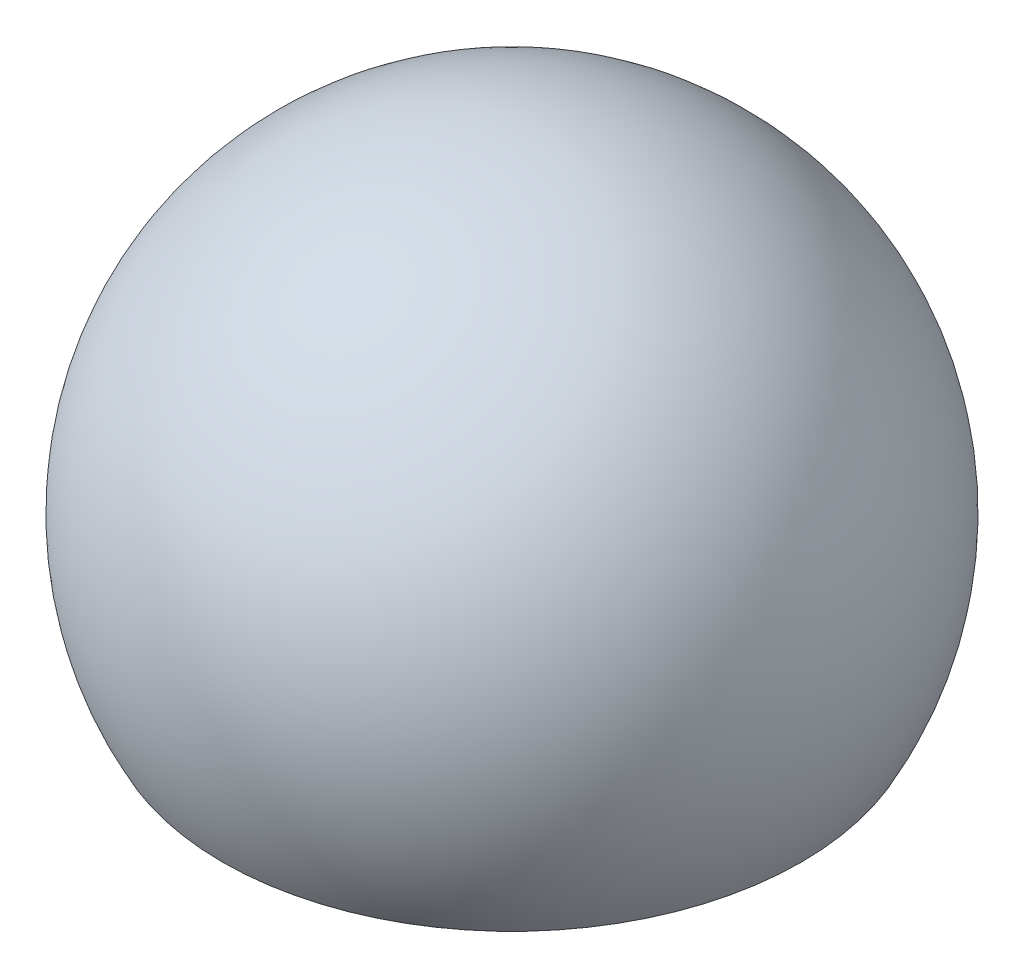
ISO-10303-21;
HEADER;
FILE_DESCRIPTION(('STEP AP214'),'2;1');
FILE_NAME('part.step','',(''),(''),'','','');
FILE_SCHEMA(('AUTOMOTIVE_DESIGN { 1 0 10303 214 1 1 1 1 }'));
ENDSEC;
DATA;
#1=APPLICATION_CONTEXT('core data for automotive mechanical design processes');
#2=APPLICATION_PROTOCOL_DEFINITION('international standard','automotive_design',2000,#1);
#3=PRODUCT_CONTEXT('',#1,'mechanical');
#4=PRODUCT('Part','Part','',(#3));
#5=PRODUCT_RELATED_PRODUCT_CATEGORY('part','',(#4));
#6=PRODUCT_DEFINITION_FORMATION('','',#4);
#7=PRODUCT_DEFINITION_CONTEXT('part definition',#1,'design');
#8=PRODUCT_DEFINITION('design','',#6,#7);
#9=PRODUCT_DEFINITION_SHAPE('','',#8);
#10=(LENGTH_UNIT() NAMED_UNIT(*) SI_UNIT(.MILLI.,.METRE.));
#11=(NAMED_UNIT(*) PLANE_ANGLE_UNIT() SI_UNIT($,.RADIAN.));
#12=(NAMED_UNIT(*) SI_UNIT($,.STERADIAN.) SOLID_ANGLE_UNIT());
#13=UNCERTAINTY_MEASURE_WITH_UNIT(LENGTH_MEASURE(1.E-05),#10,'distance_accuracy_value','');
#14=(GEOMETRIC_REPRESENTATION_CONTEXT(3) GLOBAL_UNCERTAINTY_ASSIGNED_CONTEXT((#13)) GLOBAL_UNIT_ASSIGNED_CONTEXT((#10,
#11,#12)) REPRESENTATION_CONTEXT('',''));
#15=CARTESIAN_POINT('',(0.,0.,0.));
#16=DIRECTION('',(0.,0.,1.));
#17=DIRECTION('',(1.,0.,0.));
#18=AXIS2_PLACEMENT_3D('',#15,#16,#17);
#19=CARTESIAN_POINT('',(0.,0.,0.));
#20=DIRECTION('',(0.,-1.,0.));
#21=DIRECTION('',(-1.,0.,0.));
#22=AXIS2_PLACEMENT_3D('',#19,#20,#21);
#23=SPHERICAL_SURFACE('',#22,90.);
#24=CARTESIAN_POINT('',(0.,-43.1161222746202,0.));
#25=DIRECTION('',(0.,-1.,0.));
#26=DIRECTION('',(1.,0.,0.));
#27=AXIS2_PLACEMENT_3D('',#24,#25,#26);
#28=CIRCLE('',#27,79.);
#29=CARTESIAN_POINT('',(79.,-43.1161222746202,0.));
#30=VERTEX_POINT('',#29);
#31=EDGE_CURVE('E10',#30,#30,#28,.T.);
#32=ORIENTED_EDGE('',*,*,#31,.F.);
#33=EDGE_LOOP('',(#32));
#34=FACE_BOUND('',#33,.T.);
#35=ADVANCED_FACE('F28',(#34),#23,.T.);
#36=CARTESIAN_POINT('',(-79.,-43.1161222746202,0.));
#37=DIRECTION('',(0.,1.,0.));
#38=DIRECTION('',(-1.,0.,0.));
#39=AXIS2_PLACEMENT_3D('',#36,#37,#38);
#40=PLANE('',#39);
#41=CARTESIAN_POINT('',(0.,-43.1161222746202,0.));
#42=DIRECTION('',(0.,-1.,0.));
#43=DIRECTION('',(1.,0.,0.));
#44=AXIS2_PLACEMENT_3D('',#41,#42,#43);
#45=CIRCLE('',#44,73.5);
#46=CARTESIAN_POINT('',(73.5,-43.1161222746202,0.));
#47=VERTEX_POINT('',#46);
#48=EDGE_CURVE('E34',#47,#47,#45,.T.);
#49=ORIENTED_EDGE('',*,*,#48,.F.);
#50=EDGE_LOOP('',(#49));
#51=FACE_BOUND('',#50,.T.);
#52=ORIENTED_EDGE('',*,*,#31,.T.);
#53=EDGE_LOOP('',(#52));
#54=FACE_BOUND('',#53,.T.);
#55=ADVANCED_FACE('F42',(#51,#54),#40,.F.);
#56=CARTESIAN_POINT('',(0.,2.59504281290827,0.));
#57=DIRECTION('',(0.,-1.,0.));
#58=DIRECTION('',(-1.,0.,0.));
#59=AXIS2_PLACEMENT_3D('',#56,#57,#58);
#60=SPHERICAL_SURFACE('',#59,86.5549571870917);
#61=ORIENTED_EDGE('',*,*,#48,.T.);
#62=EDGE_LOOP('',(#61));
#63=FACE_BOUND('',#62,.T.);
#64=ADVANCED_FACE('F40',(#63),#60,.F.);
#65=CLOSED_SHELL('',(#35,#55,#64));
#66=MANIFOLD_SOLID_BREP('B2',#65);
#67=ADVANCED_BREP_SHAPE_REPRESENTATION('',(#18,#66),#14);
#68=SHAPE_DEFINITION_REPRESENTATION(#9,#67);
ENDSEC;
END-ISO-10303-21;
